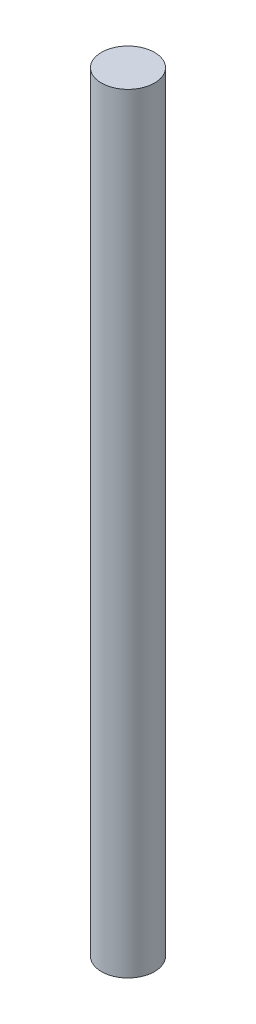
ISO-10303-21;
HEADER;
FILE_DESCRIPTION(('STEP AP214'),'2;1');
FILE_NAME('part.step','',(''),(''),'','','');
FILE_SCHEMA(('AUTOMOTIVE_DESIGN { 1 0 10303 214 1 1 1 1 }'));
ENDSEC;
DATA;
#1=APPLICATION_CONTEXT('core data for automotive mechanical design processes');
#2=APPLICATION_PROTOCOL_DEFINITION('international standard','automotive_design',2000,#1);
#3=PRODUCT_CONTEXT('',#1,'mechanical');
#4=PRODUCT('Part','Part','',(#3));
#5=PRODUCT_RELATED_PRODUCT_CATEGORY('part','',(#4));
#6=PRODUCT_DEFINITION_FORMATION('','',#4);
#7=PRODUCT_DEFINITION_CONTEXT('part definition',#1,'design');
#8=PRODUCT_DEFINITION('design','',#6,#7);
#9=PRODUCT_DEFINITION_SHAPE('','',#8);
#10=(LENGTH_UNIT() NAMED_UNIT(*) SI_UNIT(.MILLI.,.METRE.));
#11=(NAMED_UNIT(*) PLANE_ANGLE_UNIT() SI_UNIT($,.RADIAN.));
#12=(NAMED_UNIT(*) SI_UNIT($,.STERADIAN.) SOLID_ANGLE_UNIT());
#13=UNCERTAINTY_MEASURE_WITH_UNIT(LENGTH_MEASURE(1.E-05),#10,'distance_accuracy_value','');
#14=(GEOMETRIC_REPRESENTATION_CONTEXT(3) GLOBAL_UNCERTAINTY_ASSIGNED_CONTEXT((#13)) GLOBAL_UNIT_ASSIGNED_CONTEXT((#10,
#11,#12)) REPRESENTATION_CONTEXT('',''));
#15=CARTESIAN_POINT('',(0.,0.,0.));
#16=DIRECTION('',(0.,0.,1.));
#17=DIRECTION('',(1.,0.,0.));
#18=AXIS2_PLACEMENT_3D('',#15,#16,#17);
#19=CARTESIAN_POINT('',(0.,46.,0.));
#20=DIRECTION('',(0.,-1.,0.));
#21=DIRECTION('',(0.,0.,-1.));
#22=AXIS2_PLACEMENT_3D('',#19,#20,#21);
#23=CYLINDRICAL_SURFACE('',#22,1.5875);
#24=CARTESIAN_POINT('',(0.,46.,0.));
#25=DIRECTION('',(0.,1.,0.));
#26=DIRECTION('',(0.,0.,1.));
#27=AXIS2_PLACEMENT_3D('',#24,#25,#26);
#28=CIRCLE('',#27,1.5875);
#29=CARTESIAN_POINT('',(0.,46.,1.5875));
#30=VERTEX_POINT('',#29);
#31=EDGE_CURVE('E10',#30,#30,#28,.T.);
#32=ORIENTED_EDGE('',*,*,#31,.F.);
#33=EDGE_LOOP('',(#32));
#34=FACE_BOUND('',#33,.T.);
#35=CARTESIAN_POINT('',(0.,0.,0.));
#36=DIRECTION('',(0.,1.,0.));
#37=DIRECTION('',(0.,0.,1.));
#38=AXIS2_PLACEMENT_3D('',#35,#36,#37);
#39=CIRCLE('',#38,1.5875);
#40=CARTESIAN_POINT('',(0.,0.,1.5875));
#41=VERTEX_POINT('',#40);
#42=EDGE_CURVE('E34',#41,#41,#39,.T.);
#43=ORIENTED_EDGE('',*,*,#42,.T.);
#44=EDGE_LOOP('',(#43));
#45=FACE_BOUND('',#44,.T.);
#46=ADVANCED_FACE('F31',(#34,#45),#23,.T.);
#47=CARTESIAN_POINT('',(0.,46.,0.));
#48=DIRECTION('',(0.,1.,0.));
#49=DIRECTION('',(0.,0.,1.));
#50=AXIS2_PLACEMENT_3D('',#47,#48,#49);
#51=PLANE('',#50);
#52=ORIENTED_EDGE('',*,*,#31,.T.);
#53=EDGE_LOOP('',(#52));
#54=FACE_BOUND('',#53,.T.);
#55=ADVANCED_FACE('F46',(#54),#51,.T.);
#56=CARTESIAN_POINT('',(0.,0.,0.));
#57=DIRECTION('',(0.,1.,0.));
#58=DIRECTION('',(0.,0.,1.));
#59=AXIS2_PLACEMENT_3D('',#56,#57,#58);
#60=PLANE('',#59);
#61=ORIENTED_EDGE('',*,*,#42,.F.);
#62=EDGE_LOOP('',(#61));
#63=FACE_BOUND('',#62,.T.);
#64=ADVANCED_FACE('F44',(#63),#60,.F.);
#65=CLOSED_SHELL('',(#46,#55,#64));
#66=MANIFOLD_SOLID_BREP('B2',#65);
#67=ADVANCED_BREP_SHAPE_REPRESENTATION('',(#18,#66),#14);
#68=SHAPE_DEFINITION_REPRESENTATION(#9,#67);
ENDSEC;
END-ISO-10303-21;
